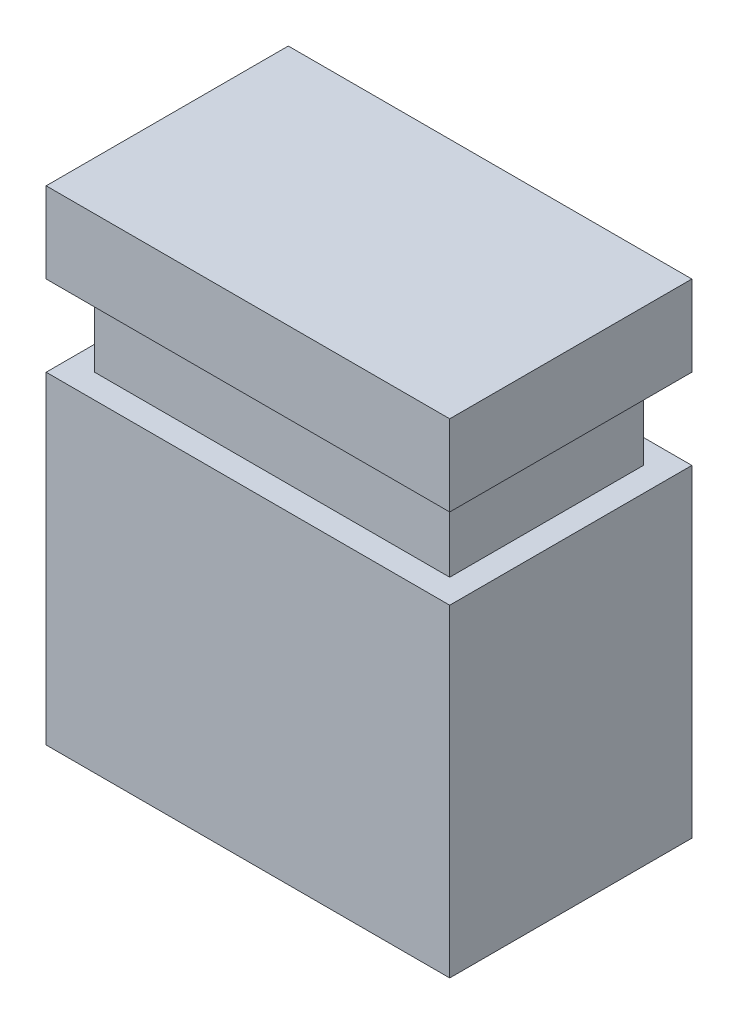
ISO-10303-21;
HEADER;
FILE_DESCRIPTION(('STEP AP214'),'2;1');
FILE_NAME('part.step','',(''),(''),'','','');
FILE_SCHEMA(('AUTOMOTIVE_DESIGN { 1 0 10303 214 1 1 1 1 }'));
ENDSEC;
DATA;
#1=APPLICATION_CONTEXT('core data for automotive mechanical design processes');
#2=APPLICATION_PROTOCOL_DEFINITION('international standard','automotive_design',2000,#1);
#3=PRODUCT_CONTEXT('',#1,'mechanical');
#4=PRODUCT('Part','Part','',(#3));
#5=PRODUCT_RELATED_PRODUCT_CATEGORY('part','',(#4));
#6=PRODUCT_DEFINITION_FORMATION('','',#4);
#7=PRODUCT_DEFINITION_CONTEXT('part definition',#1,'design');
#8=PRODUCT_DEFINITION('design','',#6,#7);
#9=PRODUCT_DEFINITION_SHAPE('','',#8);
#10=(LENGTH_UNIT() NAMED_UNIT(*) SI_UNIT(.MILLI.,.METRE.));
#11=(NAMED_UNIT(*) PLANE_ANGLE_UNIT() SI_UNIT($,.RADIAN.));
#12=(NAMED_UNIT(*) SI_UNIT($,.STERADIAN.) SOLID_ANGLE_UNIT());
#13=UNCERTAINTY_MEASURE_WITH_UNIT(LENGTH_MEASURE(1.E-05),#10,'distance_accuracy_value','');
#14=(GEOMETRIC_REPRESENTATION_CONTEXT(3) GLOBAL_UNCERTAINTY_ASSIGNED_CONTEXT((#13)) GLOBAL_UNIT_ASSIGNED_CONTEXT((#10,
#11,#12)) REPRESENTATION_CONTEXT('',''));
#15=CARTESIAN_POINT('',(0.,0.,0.));
#16=DIRECTION('',(0.,0.,1.));
#17=DIRECTION('',(1.,0.,0.));
#18=AXIS2_PLACEMENT_3D('',#15,#16,#17);
#19=CARTESIAN_POINT('',(0.885,3.707106781187,0.25));
#20=DIRECTION('',(0.,0.,1.));
#21=DIRECTION('',(1.,0.,0.));
#22=AXIS2_PLACEMENT_3D('',#19,#20,#21);
#23=PLANE('',#22);
#24=DIRECTION('',(1.,0.,0.));
#25=VECTOR('',#24,1.);
#26=CARTESIAN_POINT('',(0.885,0.2,0.25));
#27=LINE('',#26,#25);
#28=CARTESIAN_POINT('',(0.385,0.2,0.25));
#29=VERTEX_POINT('',#28);
#30=CARTESIAN_POINT('',(0.885,0.2,0.25));
#31=VERTEX_POINT('',#30);
#32=EDGE_CURVE('E20',#29,#31,#27,.T.);
#33=ORIENTED_EDGE('',*,*,#32,.F.);
#34=DIRECTION('',(0.,1.,0.));
#35=VECTOR('',#34,1.);
#36=CARTESIAN_POINT('',(0.385,3.707106781187,0.25));
#37=LINE('',#36,#35);
#38=CARTESIAN_POINT('',(0.385,2.5,0.25));
#39=VERTEX_POINT('',#38);
#40=EDGE_CURVE('E183',#29,#39,#37,.T.);
#41=ORIENTED_EDGE('',*,*,#40,.T.);
#42=DIRECTION('',(1.,0.,0.));
#43=VECTOR('',#42,1.);
#44=CARTESIAN_POINT('',(0.,2.5,0.25));
#45=LINE('',#44,#43);
#46=CARTESIAN_POINT('',(0.885,2.5,0.25));
#47=VERTEX_POINT('',#46);
#48=EDGE_CURVE('E179',#39,#47,#45,.T.);
#49=ORIENTED_EDGE('',*,*,#48,.T.);
#50=DIRECTION('',(0.,1.,0.));
#51=VECTOR('',#50,1.);
#52=CARTESIAN_POINT('',(0.885,3.707106781187,0.25));
#53=LINE('',#52,#51);
#54=EDGE_CURVE('E181',#47,#31,#53,.F.);
#55=ORIENTED_EDGE('',*,*,#54,.T.);
#56=EDGE_LOOP('',(#33,#41,#49,#55));
#57=FACE_BOUND('',#56,.T.);
#58=ADVANCED_FACE('F17',(#57),#23,.F.);
#59=CARTESIAN_POINT('',(-0.385,3.707106781187,0.25));
#60=DIRECTION('',(1.,0.,0.));
#61=DIRECTION('',(0.,0.,-1.));
#62=AXIS2_PLACEMENT_3D('',#59,#60,#61);
#63=PLANE('',#62);
#64=DIRECTION('',(0.,0.,-1.));
#65=VECTOR('',#64,1.);
#66=CARTESIAN_POINT('',(-0.385,0.2,0.25));
#67=LINE('',#66,#65);
#68=CARTESIAN_POINT('',(-0.385,0.2,0.25));
#69=VERTEX_POINT('',#68);
#70=CARTESIAN_POINT('',(-0.385,0.2,-0.25));
#71=VERTEX_POINT('',#70);
#72=EDGE_CURVE('E203',#69,#71,#67,.T.);
#73=ORIENTED_EDGE('',*,*,#72,.F.);
#74=DIRECTION('',(0.,1.,0.));
#75=VECTOR('',#74,1.);
#76=CARTESIAN_POINT('',(-0.385,3.707106781187,0.25));
#77=LINE('',#76,#75);
#78=CARTESIAN_POINT('',(-0.385,2.5,0.25));
#79=VERTEX_POINT('',#78);
#80=EDGE_CURVE('E296',#69,#79,#77,.T.);
#81=ORIENTED_EDGE('',*,*,#80,.T.);
#82=DIRECTION('',(0.,0.,1.));
#83=VECTOR('',#82,1.);
#84=CARTESIAN_POINT('',(-0.385,2.5,0.));
#85=LINE('',#84,#83);
#86=CARTESIAN_POINT('',(-0.385,2.5,-0.25));
#87=VERTEX_POINT('',#86);
#88=EDGE_CURVE('E227',#79,#87,#85,.F.);
#89=ORIENTED_EDGE('',*,*,#88,.T.);
#90=DIRECTION('',(0.,1.,0.));
#91=VECTOR('',#90,1.);
#92=CARTESIAN_POINT('',(-0.385,3.707106781187,-0.25));
#93=LINE('',#92,#91);
#94=EDGE_CURVE('E219',#87,#71,#93,.F.);
#95=ORIENTED_EDGE('',*,*,#94,.T.);
#96=EDGE_LOOP('',(#73,#81,#89,#95));
#97=FACE_BOUND('',#96,.T.);
#98=ADVANCED_FACE('F226',(#97),#63,.F.);
#99=CARTESIAN_POINT('',(0.,3.,0.));
#100=DIRECTION('',(0.,1.,0.));
#101=DIRECTION('',(0.,0.,1.));
#102=AXIS2_PLACEMENT_3D('',#99,#100,#101);
#103=PLANE('',#102);
#104=DIRECTION('',(0.,0.,1.));
#105=VECTOR('',#104,1.);
#106=CARTESIAN_POINT('',(1.25,3.,-0.75));
#107=LINE('',#106,#105);
#108=CARTESIAN_POINT('',(1.25,3.,0.75));
#109=VERTEX_POINT('',#108);
#110=CARTESIAN_POINT('',(1.25,3.,-0.75));
#111=VERTEX_POINT('',#110);
#112=EDGE_CURVE('E289',#109,#111,#107,.F.);
#113=ORIENTED_EDGE('',*,*,#112,.T.);
#114=DIRECTION('',(1.,0.,0.));
#115=VECTOR('',#114,1.);
#116=CARTESIAN_POINT('',(-1.25,3.,-0.75));
#117=LINE('',#116,#115);
#118=CARTESIAN_POINT('',(-1.25,3.,-0.75));
#119=VERTEX_POINT('',#118);
#120=EDGE_CURVE('E283',#111,#119,#117,.F.);
#121=ORIENTED_EDGE('',*,*,#120,.T.);
#122=DIRECTION('',(0.,0.,1.));
#123=VECTOR('',#122,1.);
#124=CARTESIAN_POINT('',(-1.25,3.,0.));
#125=LINE('',#124,#123);
#126=CARTESIAN_POINT('',(-1.25,3.,0.75));
#127=VERTEX_POINT('',#126);
#128=EDGE_CURVE('E189',#119,#127,#125,.T.);
#129=ORIENTED_EDGE('',*,*,#128,.T.);
#130=DIRECTION('',(-1.,0.,0.));
#131=VECTOR('',#130,1.);
#132=CARTESIAN_POINT('',(-1.25,3.,0.75));
#133=LINE('',#132,#131);
#134=EDGE_CURVE('E294',#127,#109,#133,.F.);
#135=ORIENTED_EDGE('',*,*,#134,.T.);
#136=EDGE_LOOP('',(#113,#121,#129,#135));
#137=FACE_BOUND('',#136,.T.);
#138=ADVANCED_FACE('F507',(#137),#103,.T.);
#139=CARTESIAN_POINT('',(0.,2.5,0.));
#140=DIRECTION('',(0.,1.,0.));
#141=DIRECTION('',(0.,0.,1.));
#142=AXIS2_PLACEMENT_3D('',#139,#140,#141);
#143=PLANE('',#142);
#144=DIRECTION('',(0.,0.,1.));
#145=VECTOR('',#144,1.);
#146=CARTESIAN_POINT('',(0.385,2.5,0.25));
#147=LINE('',#146,#145);
#148=CARTESIAN_POINT('',(0.385,2.5,-0.25));
#149=VERTEX_POINT('',#148);
#150=EDGE_CURVE('E237',#39,#149,#147,.F.);
#151=ORIENTED_EDGE('',*,*,#150,.T.);
#152=DIRECTION('',(-1.,0.,0.));
#153=VECTOR('',#152,1.);
#154=CARTESIAN_POINT('',(0.885,2.5,-0.25));
#155=LINE('',#154,#153);
#156=CARTESIAN_POINT('',(0.885,2.5,-0.25));
#157=VERTEX_POINT('',#156);
#158=EDGE_CURVE('E199',#149,#157,#155,.F.);
#159=ORIENTED_EDGE('',*,*,#158,.T.);
#160=DIRECTION('',(0.,0.,-1.));
#161=VECTOR('',#160,1.);
#162=CARTESIAN_POINT('',(0.885,2.5,0.25));
#163=LINE('',#162,#161);
#164=EDGE_CURVE('E188',#157,#47,#163,.F.);
#165=ORIENTED_EDGE('',*,*,#164,.T.);
#166=ORIENTED_EDGE('',*,*,#48,.F.);
#167=EDGE_LOOP('',(#151,#159,#165,#166));
#168=FACE_BOUND('',#167,.T.);
#169=ADVANCED_FACE('F198',(#168),#143,.F.);
#170=CARTESIAN_POINT('',(0.885,3.707106781187,0.25));
#171=DIRECTION('',(1.,0.,0.));
#172=DIRECTION('',(0.,0.,-1.));
#173=AXIS2_PLACEMENT_3D('',#170,#171,#172);
#174=PLANE('',#173);
#175=DIRECTION('',(0.,0.,-1.));
#176=VECTOR('',#175,1.);
#177=CARTESIAN_POINT('',(0.885,0.2,0.25));
#178=LINE('',#177,#176);
#179=CARTESIAN_POINT('',(0.885,0.2,-0.25));
#180=VERTEX_POINT('',#179);
#181=EDGE_CURVE('E195',#31,#180,#178,.T.);
#182=ORIENTED_EDGE('',*,*,#181,.F.);
#183=ORIENTED_EDGE('',*,*,#54,.F.);
#184=ORIENTED_EDGE('',*,*,#164,.F.);
#185=DIRECTION('',(0.,1.,0.));
#186=VECTOR('',#185,1.);
#187=CARTESIAN_POINT('',(0.885,3.707106781187,-0.25));
#188=LINE('',#187,#186);
#189=EDGE_CURVE('E241',#157,#180,#188,.F.);
#190=ORIENTED_EDGE('',*,*,#189,.T.);
#191=EDGE_LOOP('',(#182,#183,#184,#190));
#192=FACE_BOUND('',#191,.T.);
#193=ADVANCED_FACE('F192',(#192),#174,.F.);
#194=CARTESIAN_POINT('',(0.385,3.707106781187,0.25));
#195=DIRECTION('',(-1.,0.,0.));
#196=DIRECTION('',(0.,0.,1.));
#197=AXIS2_PLACEMENT_3D('',#194,#195,#196);
#198=PLANE('',#197);
#199=DIRECTION('',(0.,0.,1.));
#200=VECTOR('',#199,1.);
#201=CARTESIAN_POINT('',(0.385,0.2,0.25));
#202=LINE('',#201,#200);
#203=CARTESIAN_POINT('',(0.385,0.2,-0.25));
#204=VERTEX_POINT('',#203);
#205=EDGE_CURVE('E235',#204,#29,#202,.T.);
#206=ORIENTED_EDGE('',*,*,#205,.F.);
#207=DIRECTION('',(0.,1.,0.));
#208=VECTOR('',#207,1.);
#209=CARTESIAN_POINT('',(0.385,3.707106781187,-0.25));
#210=LINE('',#209,#208);
#211=EDGE_CURVE('E243',#204,#149,#210,.T.);
#212=ORIENTED_EDGE('',*,*,#211,.T.);
#213=ORIENTED_EDGE('',*,*,#150,.F.);
#214=ORIENTED_EDGE('',*,*,#40,.F.);
#215=EDGE_LOOP('',(#206,#212,#213,#214));
#216=FACE_BOUND('',#215,.T.);
#217=ADVANCED_FACE('F518',(#216),#198,.F.);
#218=CARTESIAN_POINT('',(0.,2.5,0.));
#219=DIRECTION('',(0.,1.,0.));
#220=DIRECTION('',(0.,0.,1.));
#221=AXIS2_PLACEMENT_3D('',#218,#219,#220);
#222=PLANE('',#221);
#223=DIRECTION('',(1.,0.,0.));
#224=VECTOR('',#223,1.);
#225=CARTESIAN_POINT('',(-0.885,2.5,0.25));
#226=LINE('',#225,#224);
#227=CARTESIAN_POINT('',(-0.885,2.5,0.25));
#228=VERTEX_POINT('',#227);
#229=EDGE_CURVE('E224',#79,#228,#226,.F.);
#230=ORIENTED_EDGE('',*,*,#229,.T.);
#231=DIRECTION('',(0.,0.,1.));
#232=VECTOR('',#231,1.);
#233=CARTESIAN_POINT('',(-0.885,2.5,0.25));
#234=LINE('',#233,#232);
#235=CARTESIAN_POINT('',(-0.885,2.5,-0.25));
#236=VERTEX_POINT('',#235);
#237=EDGE_CURVE('E272',#228,#236,#234,.F.);
#238=ORIENTED_EDGE('',*,*,#237,.T.);
#239=DIRECTION('',(-1.,0.,0.));
#240=VECTOR('',#239,1.);
#241=CARTESIAN_POINT('',(-0.885,2.5,-0.25));
#242=LINE('',#241,#240);
#243=EDGE_CURVE('E228',#236,#87,#242,.F.);
#244=ORIENTED_EDGE('',*,*,#243,.T.);
#245=ORIENTED_EDGE('',*,*,#88,.F.);
#246=EDGE_LOOP('',(#230,#238,#244,#245));
#247=FACE_BOUND('',#246,.T.);
#248=ADVANCED_FACE('F301',(#247),#222,.F.);
#249=CARTESIAN_POINT('',(-0.885,3.707106781187,-0.25));
#250=DIRECTION('',(0.,0.,-1.));
#251=DIRECTION('',(-1.,0.,0.));
#252=AXIS2_PLACEMENT_3D('',#249,#250,#251);
#253=PLANE('',#252);
#254=DIRECTION('',(-1.,0.,0.));
#255=VECTOR('',#254,1.);
#256=CARTESIAN_POINT('',(-0.885,0.2,-0.25));
#257=LINE('',#256,#255);
#258=CARTESIAN_POINT('',(-0.885,0.2,-0.25));
#259=VERTEX_POINT('',#258);
#260=EDGE_CURVE('E209',#71,#259,#257,.T.);
#261=ORIENTED_EDGE('',*,*,#260,.F.);
#262=ORIENTED_EDGE('',*,*,#94,.F.);
#263=ORIENTED_EDGE('',*,*,#243,.F.);
#264=DIRECTION('',(0.,1.,0.));
#265=VECTOR('',#264,1.);
#266=CARTESIAN_POINT('',(-0.885,3.707106781187,-0.25));
#267=LINE('',#266,#265);
#268=EDGE_CURVE('E222',#236,#259,#267,.F.);
#269=ORIENTED_EDGE('',*,*,#268,.T.);
#270=EDGE_LOOP('',(#261,#262,#263,#269));
#271=FACE_BOUND('',#270,.T.);
#272=ADVANCED_FACE('F218',(#271),#253,.F.);
#273=CARTESIAN_POINT('',(-0.885,3.707106781187,0.25));
#274=DIRECTION('',(0.,0.,1.));
#275=DIRECTION('',(1.,0.,0.));
#276=AXIS2_PLACEMENT_3D('',#273,#274,#275);
#277=PLANE('',#276);
#278=DIRECTION('',(1.,0.,0.));
#279=VECTOR('',#278,1.);
#280=CARTESIAN_POINT('',(-0.885,0.2,0.25));
#281=LINE('',#280,#279);
#282=CARTESIAN_POINT('',(-0.885,0.2,0.25));
#283=VERTEX_POINT('',#282);
#284=EDGE_CURVE('E211',#283,#69,#281,.T.);
#285=ORIENTED_EDGE('',*,*,#284,.F.);
#286=DIRECTION('',(0.,1.,0.));
#287=VECTOR('',#286,1.);
#288=CARTESIAN_POINT('',(-0.885,3.707106781187,0.25));
#289=LINE('',#288,#287);
#290=EDGE_CURVE('E268',#283,#228,#289,.T.);
#291=ORIENTED_EDGE('',*,*,#290,.T.);
#292=ORIENTED_EDGE('',*,*,#229,.F.);
#293=ORIENTED_EDGE('',*,*,#80,.F.);
#294=EDGE_LOOP('',(#285,#291,#292,#293));
#295=FACE_BOUND('',#294,.T.);
#296=ADVANCED_FACE('F304',(#295),#277,.F.);
#297=CARTESIAN_POINT('',(-1.25,3.,0.75));
#298=DIRECTION('',(0.,0.,-1.));
#299=DIRECTION('',(-1.,0.,0.));
#300=AXIS2_PLACEMENT_3D('',#297,#298,#299);
#301=PLANE('',#300);
#302=DIRECTION('',(0.,1.,0.));
#303=VECTOR('',#302,1.);
#304=CARTESIAN_POINT('',(1.25,3.,0.75));
#305=LINE('',#304,#303);
#306=CARTESIAN_POINT('',(1.25,2.5,0.75));
#307=VERTEX_POINT('',#306);
#308=EDGE_CURVE('E291',#307,#109,#305,.T.);
#309=ORIENTED_EDGE('',*,*,#308,.T.);
#310=ORIENTED_EDGE('',*,*,#134,.F.);
#311=DIRECTION('',(0.,1.,0.));
#312=VECTOR('',#311,1.);
#313=CARTESIAN_POINT('',(-1.25,3.,0.75));
#314=LINE('',#313,#312);
#315=CARTESIAN_POINT('',(-1.25,2.5,0.75));
#316=VERTEX_POINT('',#315);
#317=EDGE_CURVE('E277',#127,#316,#314,.F.);
#318=ORIENTED_EDGE('',*,*,#317,.T.);
#319=DIRECTION('',(1.,0.,0.));
#320=VECTOR('',#319,1.);
#321=CARTESIAN_POINT('',(0.,2.5,0.75));
#322=LINE('',#321,#320);
#323=EDGE_CURVE('E265',#316,#307,#322,.T.);
#324=ORIENTED_EDGE('',*,*,#323,.T.);
#325=EDGE_LOOP('',(#309,#310,#318,#324));
#326=FACE_BOUND('',#325,.T.);
#327=ADVANCED_FACE('F501',(#326),#301,.F.);
#328=CARTESIAN_POINT('',(1.25,3.,-0.75));
#329=DIRECTION('',(-1.,0.,0.));
#330=DIRECTION('',(0.,0.,1.));
#331=AXIS2_PLACEMENT_3D('',#328,#329,#330);
#332=PLANE('',#331);
#333=DIRECTION('',(0.,1.,0.));
#334=VECTOR('',#333,1.);
#335=CARTESIAN_POINT('',(1.25,3.,-0.75));
#336=LINE('',#335,#334);
#337=CARTESIAN_POINT('',(1.25,2.5,-0.75));
#338=VERTEX_POINT('',#337);
#339=EDGE_CURVE('E286',#338,#111,#336,.T.);
#340=ORIENTED_EDGE('',*,*,#339,.T.);
#341=ORIENTED_EDGE('',*,*,#112,.F.);
#342=ORIENTED_EDGE('',*,*,#308,.F.);
#343=DIRECTION('',(0.,0.,1.));
#344=VECTOR('',#343,1.);
#345=CARTESIAN_POINT('',(1.25,2.5,0.));
#346=LINE('',#345,#344);
#347=EDGE_CURVE('E262',#307,#338,#346,.F.);
#348=ORIENTED_EDGE('',*,*,#347,.T.);
#349=EDGE_LOOP('',(#340,#341,#342,#348));
#350=FACE_BOUND('',#349,.T.);
#351=ADVANCED_FACE('F497',(#350),#332,.F.);
#352=CARTESIAN_POINT('',(-1.25,3.,-0.75));
#353=DIRECTION('',(0.,0.,1.));
#354=DIRECTION('',(1.,0.,0.));
#355=AXIS2_PLACEMENT_3D('',#352,#353,#354);
#356=PLANE('',#355);
#357=DIRECTION('',(0.,1.,0.));
#358=VECTOR('',#357,1.);
#359=CARTESIAN_POINT('',(-1.25,3.,-0.75));
#360=LINE('',#359,#358);
#361=CARTESIAN_POINT('',(-1.25,2.5,-0.75));
#362=VERTEX_POINT('',#361);
#363=EDGE_CURVE('E280',#362,#119,#360,.T.);
#364=ORIENTED_EDGE('',*,*,#363,.T.);
#365=ORIENTED_EDGE('',*,*,#120,.F.);
#366=ORIENTED_EDGE('',*,*,#339,.F.);
#367=DIRECTION('',(1.,0.,0.));
#368=VECTOR('',#367,1.);
#369=CARTESIAN_POINT('',(0.,2.5,-0.75));
#370=LINE('',#369,#368);
#371=EDGE_CURVE('E259',#338,#362,#370,.F.);
#372=ORIENTED_EDGE('',*,*,#371,.T.);
#373=EDGE_LOOP('',(#364,#365,#366,#372));
#374=FACE_BOUND('',#373,.T.);
#375=ADVANCED_FACE('F505',(#374),#356,.F.);
#376=CARTESIAN_POINT('',(-1.25,3.,-0.75));
#377=DIRECTION('',(1.,0.,0.));
#378=DIRECTION('',(0.,0.,-1.));
#379=AXIS2_PLACEMENT_3D('',#376,#377,#378);
#380=PLANE('',#379);
#381=ORIENTED_EDGE('',*,*,#317,.F.);
#382=ORIENTED_EDGE('',*,*,#128,.F.);
#383=ORIENTED_EDGE('',*,*,#363,.F.);
#384=DIRECTION('',(0.,0.,1.));
#385=VECTOR('',#384,1.);
#386=CARTESIAN_POINT('',(-1.25,2.5,0.));
#387=LINE('',#386,#385);
#388=EDGE_CURVE('E253',#362,#316,#387,.T.);
#389=ORIENTED_EDGE('',*,*,#388,.T.);
#390=EDGE_LOOP('',(#381,#382,#383,#389));
#391=FACE_BOUND('',#390,.T.);
#392=ADVANCED_FACE('F317',(#391),#380,.F.);
#393=CARTESIAN_POINT('',(0.885,3.707106781187,-0.25));
#394=DIRECTION('',(0.,0.,-1.));
#395=DIRECTION('',(-1.,0.,0.));
#396=AXIS2_PLACEMENT_3D('',#393,#394,#395);
#397=PLANE('',#396);
#398=DIRECTION('',(1.,0.,0.));
#399=VECTOR('',#398,1.);
#400=CARTESIAN_POINT('',(0.,0.2,-0.25));
#401=LINE('',#400,#399);
#402=EDGE_CURVE('E240',#204,#180,#401,.T.);
#403=ORIENTED_EDGE('',*,*,#402,.T.);
#404=ORIENTED_EDGE('',*,*,#189,.F.);
#405=ORIENTED_EDGE('',*,*,#158,.F.);
#406=ORIENTED_EDGE('',*,*,#211,.F.);
#407=EDGE_LOOP('',(#403,#404,#405,#406));
#408=FACE_BOUND('',#407,.T.);
#409=ADVANCED_FACE('F246',(#408),#397,.F.);
#410=CARTESIAN_POINT('',(-0.885,3.707106781187,0.25));
#411=DIRECTION('',(-1.,0.,0.));
#412=DIRECTION('',(0.,0.,1.));
#413=AXIS2_PLACEMENT_3D('',#410,#411,#412);
#414=PLANE('',#413);
#415=DIRECTION('',(0.,0.,1.));
#416=VECTOR('',#415,1.);
#417=CARTESIAN_POINT('',(-0.885,0.2,0.));
#418=LINE('',#417,#416);
#419=EDGE_CURVE('E248',#283,#259,#418,.F.);
#420=ORIENTED_EDGE('',*,*,#419,.T.);
#421=ORIENTED_EDGE('',*,*,#268,.F.);
#422=ORIENTED_EDGE('',*,*,#237,.F.);
#423=ORIENTED_EDGE('',*,*,#290,.F.);
#424=EDGE_LOOP('',(#420,#421,#422,#423));
#425=FACE_BOUND('',#424,.T.);
#426=ADVANCED_FACE('F306',(#425),#414,.F.);
#427=CARTESIAN_POINT('',(0.,2.5,0.));
#428=DIRECTION('',(0.,1.,0.));
#429=DIRECTION('',(0.,0.,1.));
#430=AXIS2_PLACEMENT_3D('',#427,#428,#429);
#431=PLANE('',#430);
#432=DIRECTION('',(0.,0.,-1.));
#433=VECTOR('',#432,1.);
#434=CARTESIAN_POINT('',(-1.1,2.5,-0.6));
#435=LINE('',#434,#433);
#436=CARTESIAN_POINT('',(-1.1,2.5,-0.6));
#437=VERTEX_POINT('',#436);
#438=CARTESIAN_POINT('',(-1.1,2.5,0.6));
#439=VERTEX_POINT('',#438);
#440=EDGE_CURVE('E425',#437,#439,#435,.F.);
#441=ORIENTED_EDGE('',*,*,#440,.T.);
#442=DIRECTION('',(-1.,0.,0.));
#443=VECTOR('',#442,1.);
#444=CARTESIAN_POINT('',(1.1,2.5,0.6));
#445=LINE('',#444,#443);
#446=CARTESIAN_POINT('',(1.1,2.5,0.6));
#447=VERTEX_POINT('',#446);
#448=EDGE_CURVE('E251',#439,#447,#445,.F.);
#449=ORIENTED_EDGE('',*,*,#448,.T.);
#450=DIRECTION('',(0.,0.,1.));
#451=VECTOR('',#450,1.);
#452=CARTESIAN_POINT('',(1.1,2.5,0.));
#453=LINE('',#452,#451);
#454=CARTESIAN_POINT('',(1.1,2.5,-0.6));
#455=VERTEX_POINT('',#454);
#456=EDGE_CURVE('E249',#455,#447,#453,.T.);
#457=ORIENTED_EDGE('',*,*,#456,.F.);
#458=DIRECTION('',(1.,0.,0.));
#459=VECTOR('',#458,1.);
#460=CARTESIAN_POINT('',(1.1,2.5,-0.6));
#461=LINE('',#460,#459);
#462=EDGE_CURVE('E419',#455,#437,#461,.F.);
#463=ORIENTED_EDGE('',*,*,#462,.T.);
#464=EDGE_LOOP('',(#441,#449,#457,#463));
#465=FACE_BOUND('',#464,.T.);
#466=ORIENTED_EDGE('',*,*,#371,.F.);
#467=ORIENTED_EDGE('',*,*,#347,.F.);
#468=ORIENTED_EDGE('',*,*,#323,.F.);
#469=ORIENTED_EDGE('',*,*,#388,.F.);
#470=EDGE_LOOP('',(#466,#467,#468,#469));
#471=FACE_BOUND('',#470,.T.);
#472=ADVANCED_FACE('F308',(#465,#471),#431,.F.);
#473=CARTESIAN_POINT('',(0.,0.2,0.));
#474=DIRECTION('',(0.,1.,0.));
#475=DIRECTION('',(0.,0.,1.));
#476=AXIS2_PLACEMENT_3D('',#473,#474,#475);
#477=PLANE('',#476);
#478=DIRECTION('',(-1.,0.,0.));
#479=VECTOR('',#478,1.);
#480=CARTESIAN_POINT('',(1.,0.2,-0.5));
#481=LINE('',#480,#479);
#482=CARTESIAN_POINT('',(-1.,0.2,-0.5));
#483=VERTEX_POINT('',#482);
#484=CARTESIAN_POINT('',(1.,0.2,-0.5));
#485=VERTEX_POINT('',#484);
#486=EDGE_CURVE('E384',#483,#485,#481,.F.);
#487=ORIENTED_EDGE('',*,*,#486,.T.);
#488=DIRECTION('',(0.,0.,-1.));
#489=VECTOR('',#488,1.);
#490=CARTESIAN_POINT('',(1.,0.2,0.5));
#491=LINE('',#490,#489);
#492=CARTESIAN_POINT('',(1.,0.2,0.5));
#493=VERTEX_POINT('',#492);
#494=EDGE_CURVE('E385',#485,#493,#491,.F.);
#495=ORIENTED_EDGE('',*,*,#494,.T.);
#496=DIRECTION('',(1.,0.,0.));
#497=VECTOR('',#496,1.);
#498=CARTESIAN_POINT('',(1.,0.2,0.5));
#499=LINE('',#498,#497);
#500=CARTESIAN_POINT('',(-1.,0.2,0.5));
#501=VERTEX_POINT('',#500);
#502=EDGE_CURVE('E404',#493,#501,#499,.F.);
#503=ORIENTED_EDGE('',*,*,#502,.T.);
#504=DIRECTION('',(0.,0.,1.));
#505=VECTOR('',#504,1.);
#506=CARTESIAN_POINT('',(-1.,0.2,0.5));
#507=LINE('',#506,#505);
#508=EDGE_CURVE('E388',#501,#483,#507,.F.);
#509=ORIENTED_EDGE('',*,*,#508,.T.);
#510=EDGE_LOOP('',(#487,#495,#503,#509));
#511=FACE_BOUND('',#510,.T.);
#512=ORIENTED_EDGE('',*,*,#284,.T.);
#513=ORIENTED_EDGE('',*,*,#72,.T.);
#514=ORIENTED_EDGE('',*,*,#260,.T.);
#515=ORIENTED_EDGE('',*,*,#419,.F.);
#516=EDGE_LOOP('',(#512,#513,#514,#515));
#517=FACE_BOUND('',#516,.T.);
#518=ORIENTED_EDGE('',*,*,#205,.T.);
#519=ORIENTED_EDGE('',*,*,#32,.T.);
#520=ORIENTED_EDGE('',*,*,#181,.T.);
#521=ORIENTED_EDGE('',*,*,#402,.F.);
#522=EDGE_LOOP('',(#518,#519,#520,#521));
#523=FACE_BOUND('',#522,.T.);
#524=ADVANCED_FACE('F207',(#511,#517,#523),#477,.F.);
#525=CARTESIAN_POINT('',(1.1,2.5,0.6));
#526=DIRECTION('',(0.,0.,-1.));
#527=DIRECTION('',(-1.,0.,0.));
#528=AXIS2_PLACEMENT_3D('',#525,#526,#527);
#529=PLANE('',#528);
#530=DIRECTION('',(0.,1.,0.));
#531=VECTOR('',#530,1.);
#532=CARTESIAN_POINT('',(1.1,2.5,0.6));
#533=LINE('',#532,#531);
#534=CARTESIAN_POINT('',(1.1,2.,0.6));
#535=VERTEX_POINT('',#534);
#536=EDGE_CURVE('E413',#535,#447,#533,.T.);
#537=ORIENTED_EDGE('',*,*,#536,.T.);
#538=ORIENTED_EDGE('',*,*,#448,.F.);
#539=DIRECTION('',(0.,1.,0.));
#540=VECTOR('',#539,1.);
#541=CARTESIAN_POINT('',(-1.1,2.5,0.6));
#542=LINE('',#541,#540);
#543=CARTESIAN_POINT('',(-1.1,2.,0.6));
#544=VERTEX_POINT('',#543);
#545=EDGE_CURVE('E422',#439,#544,#542,.F.);
#546=ORIENTED_EDGE('',*,*,#545,.T.);
#547=DIRECTION('',(1.,0.,0.));
#548=VECTOR('',#547,1.);
#549=CARTESIAN_POINT('',(0.,2.,0.6));
#550=LINE('',#549,#548);
#551=EDGE_CURVE('E432',#535,#544,#550,.F.);
#552=ORIENTED_EDGE('',*,*,#551,.F.);
#553=EDGE_LOOP('',(#537,#538,#546,#552));
#554=FACE_BOUND('',#553,.T.);
#555=ADVANCED_FACE('F373',(#554),#529,.F.);
#556=CARTESIAN_POINT('',(-1.1,2.5,-0.6));
#557=DIRECTION('',(1.,0.,0.));
#558=DIRECTION('',(0.,0.,-1.));
#559=AXIS2_PLACEMENT_3D('',#556,#557,#558);
#560=PLANE('',#559);
#561=ORIENTED_EDGE('',*,*,#545,.F.);
#562=ORIENTED_EDGE('',*,*,#440,.F.);
#563=DIRECTION('',(0.,1.,0.));
#564=VECTOR('',#563,1.);
#565=CARTESIAN_POINT('',(-1.1,2.5,-0.6));
#566=LINE('',#565,#564);
#567=CARTESIAN_POINT('',(-1.1,2.,-0.6));
#568=VERTEX_POINT('',#567);
#569=EDGE_CURVE('E416',#437,#568,#566,.F.);
#570=ORIENTED_EDGE('',*,*,#569,.T.);
#571=DIRECTION('',(0.,0.,1.));
#572=VECTOR('',#571,1.);
#573=CARTESIAN_POINT('',(-1.1,2.,0.));
#574=LINE('',#573,#572);
#575=EDGE_CURVE('E445',#544,#568,#574,.F.);
#576=ORIENTED_EDGE('',*,*,#575,.F.);
#577=EDGE_LOOP('',(#561,#562,#570,#576));
#578=FACE_BOUND('',#577,.T.);
#579=ADVANCED_FACE('F369',(#578),#560,.F.);
#580=CARTESIAN_POINT('',(1.1,2.5,-0.6));
#581=DIRECTION('',(0.,0.,1.));
#582=DIRECTION('',(1.,0.,0.));
#583=AXIS2_PLACEMENT_3D('',#580,#581,#582);
#584=PLANE('',#583);
#585=ORIENTED_EDGE('',*,*,#569,.F.);
#586=ORIENTED_EDGE('',*,*,#462,.F.);
#587=DIRECTION('',(0.,1.,0.));
#588=VECTOR('',#587,1.);
#589=CARTESIAN_POINT('',(1.1,2.5,-0.6));
#590=LINE('',#589,#588);
#591=CARTESIAN_POINT('',(1.1,2.,-0.6));
#592=VERTEX_POINT('',#591);
#593=EDGE_CURVE('E410',#455,#592,#590,.F.);
#594=ORIENTED_EDGE('',*,*,#593,.T.);
#595=DIRECTION('',(1.,0.,0.));
#596=VECTOR('',#595,1.);
#597=CARTESIAN_POINT('',(0.,2.,-0.6));
#598=LINE('',#597,#596);
#599=EDGE_CURVE('E439',#568,#592,#598,.T.);
#600=ORIENTED_EDGE('',*,*,#599,.F.);
#601=EDGE_LOOP('',(#585,#586,#594,#600));
#602=FACE_BOUND('',#601,.T.);
#603=ADVANCED_FACE('F365',(#602),#584,.F.);
#604=CARTESIAN_POINT('',(1.1,2.5,-0.6));
#605=DIRECTION('',(-1.,0.,0.));
#606=DIRECTION('',(0.,0.,1.));
#607=AXIS2_PLACEMENT_3D('',#604,#605,#606);
#608=PLANE('',#607);
#609=ORIENTED_EDGE('',*,*,#593,.F.);
#610=ORIENTED_EDGE('',*,*,#456,.T.);
#611=ORIENTED_EDGE('',*,*,#536,.F.);
#612=DIRECTION('',(0.,0.,1.));
#613=VECTOR('',#612,1.);
#614=CARTESIAN_POINT('',(1.1,2.,0.));
#615=LINE('',#614,#613);
#616=EDGE_CURVE('E436',#592,#535,#615,.T.);
#617=ORIENTED_EDGE('',*,*,#616,.F.);
#618=EDGE_LOOP('',(#609,#610,#611,#617));
#619=FACE_BOUND('',#618,.T.);
#620=ADVANCED_FACE('F361',(#619),#608,.F.);
#621=CARTESIAN_POINT('',(1.,0.2,0.5));
#622=DIRECTION('',(1.,0.,0.));
#623=DIRECTION('',(0.,0.,-1.));
#624=AXIS2_PLACEMENT_3D('',#621,#622,#623);
#625=PLANE('',#624);
#626=DIRECTION('',(0.,1.,0.));
#627=VECTOR('',#626,1.);
#628=CARTESIAN_POINT('',(1.,0.2,0.5));
#629=LINE('',#628,#627);
#630=CARTESIAN_POINT('',(1.,0.,0.5));
#631=VERTEX_POINT('',#630);
#632=EDGE_CURVE('E406',#631,#493,#629,.T.);
#633=ORIENTED_EDGE('',*,*,#632,.T.);
#634=ORIENTED_EDGE('',*,*,#494,.F.);
#635=DIRECTION('',(0.,1.,0.));
#636=VECTOR('',#635,1.);
#637=CARTESIAN_POINT('',(1.,0.2,-0.5));
#638=LINE('',#637,#636);
#639=CARTESIAN_POINT('',(1.,0.,-0.5));
#640=VERTEX_POINT('',#639);
#641=EDGE_CURVE('E391',#485,#640,#638,.F.);
#642=ORIENTED_EDGE('',*,*,#641,.T.);
#643=DIRECTION('',(0.,0.,1.));
#644=VECTOR('',#643,1.);
#645=CARTESIAN_POINT('',(1.,0.,0.));
#646=LINE('',#645,#644);
#647=EDGE_CURVE('E483',#640,#631,#646,.T.);
#648=ORIENTED_EDGE('',*,*,#647,.T.);
#649=EDGE_LOOP('',(#633,#634,#642,#648));
#650=FACE_BOUND('',#649,.T.);
#651=ADVANCED_FACE('F357',(#650),#625,.F.);
#652=CARTESIAN_POINT('',(1.,0.2,0.5));
#653=DIRECTION('',(0.,0.,1.));
#654=DIRECTION('',(1.,0.,0.));
#655=AXIS2_PLACEMENT_3D('',#652,#653,#654);
#656=PLANE('',#655);
#657=DIRECTION('',(0.,1.,0.));
#658=VECTOR('',#657,1.);
#659=CARTESIAN_POINT('',(-1.,0.2,0.5));
#660=LINE('',#659,#658);
#661=CARTESIAN_POINT('',(-1.,0.,0.5));
#662=VERTEX_POINT('',#661);
#663=EDGE_CURVE('E401',#662,#501,#660,.T.);
#664=ORIENTED_EDGE('',*,*,#663,.T.);
#665=ORIENTED_EDGE('',*,*,#502,.F.);
#666=ORIENTED_EDGE('',*,*,#632,.F.);
#667=DIRECTION('',(1.,0.,0.));
#668=VECTOR('',#667,1.);
#669=CARTESIAN_POINT('',(0.,0.,0.5));
#670=LINE('',#669,#668);
#671=EDGE_CURVE('E480',#631,#662,#670,.F.);
#672=ORIENTED_EDGE('',*,*,#671,.T.);
#673=EDGE_LOOP('',(#664,#665,#666,#672));
#674=FACE_BOUND('',#673,.T.);
#675=ADVANCED_FACE('F353',(#674),#656,.F.);
#676=CARTESIAN_POINT('',(-1.,0.2,0.5));
#677=DIRECTION('',(-1.,0.,0.));
#678=DIRECTION('',(0.,0.,1.));
#679=AXIS2_PLACEMENT_3D('',#676,#677,#678);
#680=PLANE('',#679);
#681=DIRECTION('',(0.,1.,0.));
#682=VECTOR('',#681,1.);
#683=CARTESIAN_POINT('',(-1.,0.2,-0.5));
#684=LINE('',#683,#682);
#685=CARTESIAN_POINT('',(-1.,0.,-0.5));
#686=VERTEX_POINT('',#685);
#687=EDGE_CURVE('E392',#686,#483,#684,.T.);
#688=ORIENTED_EDGE('',*,*,#687,.T.);
#689=ORIENTED_EDGE('',*,*,#508,.F.);
#690=ORIENTED_EDGE('',*,*,#663,.F.);
#691=DIRECTION('',(0.,0.,1.));
#692=VECTOR('',#691,1.);
#693=CARTESIAN_POINT('',(-1.,0.,0.));
#694=LINE('',#693,#692);
#695=EDGE_CURVE('E477',#662,#686,#694,.F.);
#696=ORIENTED_EDGE('',*,*,#695,.T.);
#697=EDGE_LOOP('',(#688,#689,#690,#696));
#698=FACE_BOUND('',#697,.T.);
#699=ADVANCED_FACE('F349',(#698),#680,.F.);
#700=CARTESIAN_POINT('',(1.,0.2,-0.5));
#701=DIRECTION('',(0.,0.,-1.));
#702=DIRECTION('',(-1.,0.,0.));
#703=AXIS2_PLACEMENT_3D('',#700,#701,#702);
#704=PLANE('',#703);
#705=ORIENTED_EDGE('',*,*,#641,.F.);
#706=ORIENTED_EDGE('',*,*,#486,.F.);
#707=ORIENTED_EDGE('',*,*,#687,.F.);
#708=DIRECTION('',(1.,0.,0.));
#709=VECTOR('',#708,1.);
#710=CARTESIAN_POINT('',(0.,0.,-0.5));
#711=LINE('',#710,#709);
#712=EDGE_CURVE('E474',#686,#640,#711,.T.);
#713=ORIENTED_EDGE('',*,*,#712,.T.);
#714=EDGE_LOOP('',(#705,#706,#707,#713));
#715=FACE_BOUND('',#714,.T.);
#716=ADVANCED_FACE('F345',(#715),#704,.F.);
#717=CARTESIAN_POINT('',(-1.25,2.,0.75));
#718=DIRECTION('',(0.,0.,-1.));
#719=DIRECTION('',(-1.,0.,0.));
#720=AXIS2_PLACEMENT_3D('',#717,#718,#719);
#721=PLANE('',#720);
#722=DIRECTION('',(0.,1.,0.));
#723=VECTOR('',#722,1.);
#724=CARTESIAN_POINT('',(1.25,2.,0.75));
#725=LINE('',#724,#723);
#726=CARTESIAN_POINT('',(1.25,0.,0.75));
#727=VERTEX_POINT('',#726);
#728=CARTESIAN_POINT('',(1.25,2.,0.75));
#729=VERTEX_POINT('',#728);
#730=EDGE_CURVE('E395',#727,#729,#725,.T.);
#731=ORIENTED_EDGE('',*,*,#730,.T.);
#732=DIRECTION('',(1.,0.,0.));
#733=VECTOR('',#732,1.);
#734=CARTESIAN_POINT('',(0.,2.,0.75));
#735=LINE('',#734,#733);
#736=CARTESIAN_POINT('',(-1.25,2.,0.75));
#737=VERTEX_POINT('',#736);
#738=EDGE_CURVE('E451',#737,#729,#735,.T.);
#739=ORIENTED_EDGE('',*,*,#738,.F.);
#740=DIRECTION('',(0.,1.,0.));
#741=VECTOR('',#740,1.);
#742=CARTESIAN_POINT('',(-1.25,2.,0.75));
#743=LINE('',#742,#741);
#744=CARTESIAN_POINT('',(-1.25,0.,0.75));
#745=VERTEX_POINT('',#744);
#746=EDGE_CURVE('E443',#737,#745,#743,.F.);
#747=ORIENTED_EDGE('',*,*,#746,.T.);
#748=DIRECTION('',(1.,0.,0.));
#749=VECTOR('',#748,1.);
#750=CARTESIAN_POINT('',(0.,0.,0.75));
#751=LINE('',#750,#749);
#752=EDGE_CURVE('E457',#745,#727,#751,.T.);
#753=ORIENTED_EDGE('',*,*,#752,.T.);
#754=EDGE_LOOP('',(#731,#739,#747,#753));
#755=FACE_BOUND('',#754,.T.);
#756=ADVANCED_FACE('F341',(#755),#721,.F.);
#757=CARTESIAN_POINT('',(1.25,2.,-0.75));
#758=DIRECTION('',(-1.,0.,0.));
#759=DIRECTION('',(0.,0.,1.));
#760=AXIS2_PLACEMENT_3D('',#757,#758,#759);
#761=PLANE('',#760);
#762=DIRECTION('',(0.,1.,0.));
#763=VECTOR('',#762,1.);
#764=CARTESIAN_POINT('',(1.25,2.,-0.75));
#765=LINE('',#764,#763);
#766=CARTESIAN_POINT('',(1.25,0.,-0.75));
#767=VERTEX_POINT('',#766);
#768=CARTESIAN_POINT('',(1.25,2.,-0.75));
#769=VERTEX_POINT('',#768);
#770=EDGE_CURVE('E464',#767,#769,#765,.T.);
#771=ORIENTED_EDGE('',*,*,#770,.T.);
#772=DIRECTION('',(0.,0.,1.));
#773=VECTOR('',#772,1.);
#774=CARTESIAN_POINT('',(1.25,2.,0.));
#775=LINE('',#774,#773);
#776=EDGE_CURVE('E454',#729,#769,#775,.F.);
#777=ORIENTED_EDGE('',*,*,#776,.F.);
#778=ORIENTED_EDGE('',*,*,#730,.F.);
#779=DIRECTION('',(0.,0.,1.));
#780=VECTOR('',#779,1.);
#781=CARTESIAN_POINT('',(1.25,0.,0.));
#782=LINE('',#781,#780);
#783=EDGE_CURVE('E465',#727,#767,#782,.F.);
#784=ORIENTED_EDGE('',*,*,#783,.T.);
#785=EDGE_LOOP('',(#771,#777,#778,#784));
#786=FACE_BOUND('',#785,.T.);
#787=ADVANCED_FACE('F337',(#786),#761,.F.);
#788=CARTESIAN_POINT('',(0.,2.,0.));
#789=DIRECTION('',(0.,1.,0.));
#790=DIRECTION('',(0.,0.,1.));
#791=AXIS2_PLACEMENT_3D('',#788,#789,#790);
#792=PLANE('',#791);
#793=ORIENTED_EDGE('',*,*,#599,.T.);
#794=ORIENTED_EDGE('',*,*,#616,.T.);
#795=ORIENTED_EDGE('',*,*,#551,.T.);
#796=ORIENTED_EDGE('',*,*,#575,.T.);
#797=EDGE_LOOP('',(#793,#794,#795,#796));
#798=FACE_BOUND('',#797,.T.);
#799=DIRECTION('',(0.,0.,-1.));
#800=VECTOR('',#799,1.);
#801=CARTESIAN_POINT('',(-1.25,2.,-0.75));
#802=LINE('',#801,#800);
#803=CARTESIAN_POINT('',(-1.25,2.,-0.75));
#804=VERTEX_POINT('',#803);
#805=EDGE_CURVE('E440',#804,#737,#802,.F.);
#806=ORIENTED_EDGE('',*,*,#805,.T.);
#807=ORIENTED_EDGE('',*,*,#738,.T.);
#808=ORIENTED_EDGE('',*,*,#776,.T.);
#809=DIRECTION('',(1.,0.,0.));
#810=VECTOR('',#809,1.);
#811=CARTESIAN_POINT('',(-1.25,2.,-0.75));
#812=LINE('',#811,#810);
#813=EDGE_CURVE('E466',#769,#804,#812,.F.);
#814=ORIENTED_EDGE('',*,*,#813,.T.);
#815=EDGE_LOOP('',(#806,#807,#808,#814));
#816=FACE_BOUND('',#815,.T.);
#817=ADVANCED_FACE('F333',(#798,#816),#792,.T.);
#818=CARTESIAN_POINT('',(-1.25,2.,-0.75));
#819=DIRECTION('',(1.,0.,0.));
#820=DIRECTION('',(0.,0.,-1.));
#821=AXIS2_PLACEMENT_3D('',#818,#819,#820);
#822=PLANE('',#821);
#823=ORIENTED_EDGE('',*,*,#746,.F.);
#824=ORIENTED_EDGE('',*,*,#805,.F.);
#825=DIRECTION('',(0.,1.,0.));
#826=VECTOR('',#825,1.);
#827=CARTESIAN_POINT('',(-1.25,2.,-0.75));
#828=LINE('',#827,#826);
#829=CARTESIAN_POINT('',(-1.25,0.,-0.75));
#830=VERTEX_POINT('',#829);
#831=EDGE_CURVE('E26',#804,#830,#828,.F.);
#832=ORIENTED_EDGE('',*,*,#831,.T.);
#833=DIRECTION('',(0.,0.,1.));
#834=VECTOR('',#833,1.);
#835=CARTESIAN_POINT('',(-1.25,0.,0.));
#836=LINE('',#835,#834);
#837=EDGE_CURVE('E34',#830,#745,#836,.T.);
#838=ORIENTED_EDGE('',*,*,#837,.T.);
#839=EDGE_LOOP('',(#823,#824,#832,#838));
#840=FACE_BOUND('',#839,.T.);
#841=ADVANCED_FACE('F327',(#840),#822,.F.);
#842=CARTESIAN_POINT('',(0.,0.,0.));
#843=DIRECTION('',(0.,1.,0.));
#844=DIRECTION('',(0.,0.,1.));
#845=AXIS2_PLACEMENT_3D('',#842,#843,#844);
#846=PLANE('',#845);
#847=ORIENTED_EDGE('',*,*,#752,.F.);
#848=ORIENTED_EDGE('',*,*,#837,.F.);
#849=DIRECTION('',(1.,0.,0.));
#850=VECTOR('',#849,1.);
#851=CARTESIAN_POINT('',(-1.25,0.,-0.75));
#852=LINE('',#851,#850);
#853=EDGE_CURVE('E11',#830,#767,#852,.T.);
#854=ORIENTED_EDGE('',*,*,#853,.T.);
#855=ORIENTED_EDGE('',*,*,#783,.F.);
#856=EDGE_LOOP('',(#847,#848,#854,#855));
#857=FACE_BOUND('',#856,.T.);
#858=ORIENTED_EDGE('',*,*,#695,.F.);
#859=ORIENTED_EDGE('',*,*,#671,.F.);
#860=ORIENTED_EDGE('',*,*,#647,.F.);
#861=ORIENTED_EDGE('',*,*,#712,.F.);
#862=EDGE_LOOP('',(#858,#859,#860,#861));
#863=FACE_BOUND('',#862,.T.);
#864=ADVANCED_FACE('F321',(#857,#863),#846,.F.);
#865=CARTESIAN_POINT('',(-1.25,2.,-0.75));
#866=DIRECTION('',(0.,0.,1.));
#867=DIRECTION('',(1.,0.,0.));
#868=AXIS2_PLACEMENT_3D('',#865,#866,#867);
#869=PLANE('',#868);
#870=ORIENTED_EDGE('',*,*,#831,.F.);
#871=ORIENTED_EDGE('',*,*,#813,.F.);
#872=ORIENTED_EDGE('',*,*,#770,.F.);
#873=ORIENTED_EDGE('',*,*,#853,.F.);
#874=EDGE_LOOP('',(#870,#871,#872,#873));
#875=FACE_BOUND('',#874,.T.);
#876=ADVANCED_FACE('F319',(#875),#869,.F.);
#877=CLOSED_SHELL('',(#58,#98,#138,#169,#193,#217,#248,#272,#296,#327,#351,#375,#392,#409,#426,
#472,#524,#555,#579,#603,#620,#651,#675,#699,#716,#756,#787,#817,#841,#864,#876));
#878=MANIFOLD_SOLID_BREP('B1',#877);
#879=ADVANCED_BREP_SHAPE_REPRESENTATION('',(#18,#878),#14);
#880=SHAPE_DEFINITION_REPRESENTATION(#9,#879);
ENDSEC;
END-ISO-10303-21;
